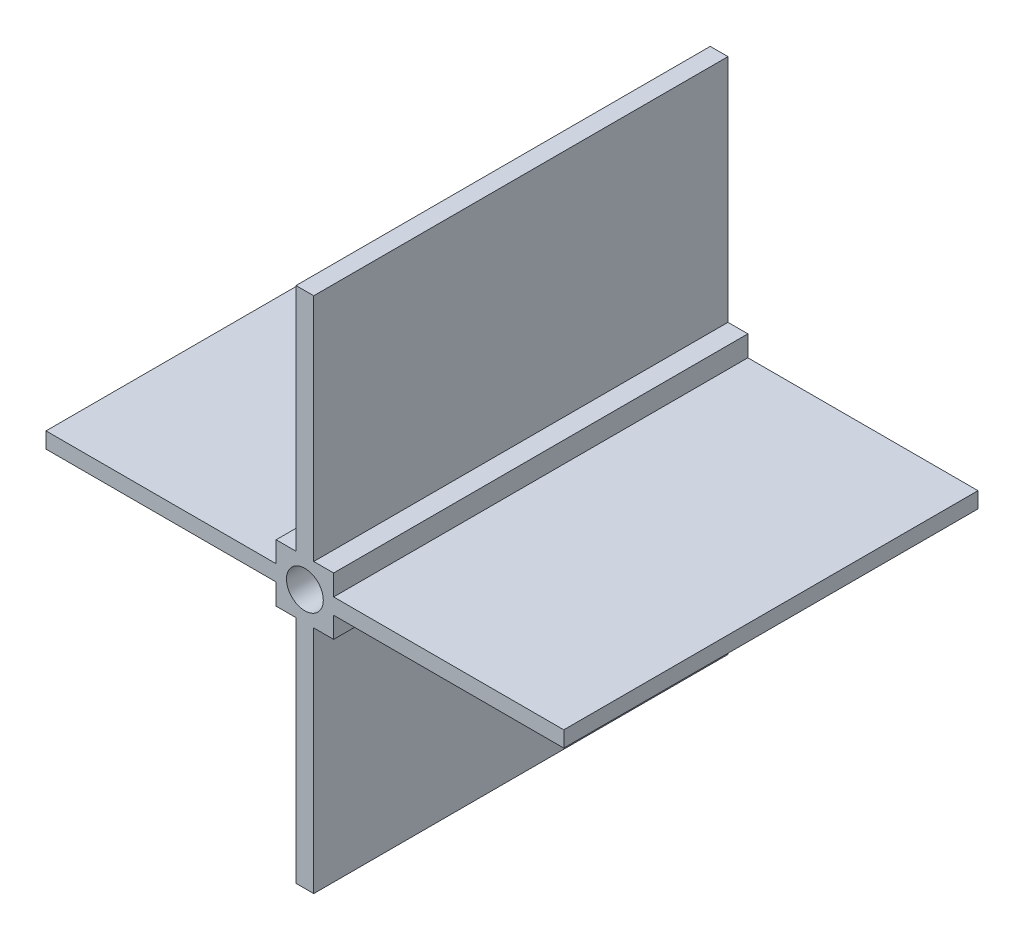
ISO-10303-21;
HEADER;
FILE_DESCRIPTION(('STEP AP214'),'2;1');
FILE_NAME('part.step','',(''),(''),'','','');
FILE_SCHEMA(('AUTOMOTIVE_DESIGN { 1 0 10303 214 1 1 1 1 }'));
ENDSEC;
DATA;
#1=APPLICATION_CONTEXT('core data for automotive mechanical design processes');
#2=APPLICATION_PROTOCOL_DEFINITION('international standard','automotive_design',2000,#1);
#3=PRODUCT_CONTEXT('',#1,'mechanical');
#4=PRODUCT('Part','Part','',(#3));
#5=PRODUCT_RELATED_PRODUCT_CATEGORY('part','',(#4));
#6=PRODUCT_DEFINITION_FORMATION('','',#4);
#7=PRODUCT_DEFINITION_CONTEXT('part definition',#1,'design');
#8=PRODUCT_DEFINITION('design','',#6,#7);
#9=PRODUCT_DEFINITION_SHAPE('','',#8);
#10=(LENGTH_UNIT() NAMED_UNIT(*) SI_UNIT(.MILLI.,.METRE.));
#11=(NAMED_UNIT(*) PLANE_ANGLE_UNIT() SI_UNIT($,.RADIAN.));
#12=(NAMED_UNIT(*) SI_UNIT($,.STERADIAN.) SOLID_ANGLE_UNIT());
#13=UNCERTAINTY_MEASURE_WITH_UNIT(LENGTH_MEASURE(1.E-05),#10,'distance_accuracy_value','');
#14=(GEOMETRIC_REPRESENTATION_CONTEXT(3) GLOBAL_UNCERTAINTY_ASSIGNED_CONTEXT((#13)) GLOBAL_UNIT_ASSIGNED_CONTEXT((#10,
#11,#12)) REPRESENTATION_CONTEXT('',''));
#15=CARTESIAN_POINT('',(0.,0.,0.));
#16=DIRECTION('',(0.,0.,1.));
#17=DIRECTION('',(1.,0.,0.));
#18=AXIS2_PLACEMENT_3D('',#15,#16,#17);
#19=CARTESIAN_POINT('',(0.978019252924109,3.175,45.72));
#20=DIRECTION('',(0.,-1.,0.));
#21=DIRECTION('',(0.,0.,-1.));
#22=AXIS2_PLACEMENT_3D('',#19,#20,#21);
#23=PLANE('',#22);
#24=DIRECTION('',(-1.,0.,0.));
#25=VECTOR('',#24,1.);
#26=CARTESIAN_POINT('',(0.978019252924109,3.175,0.));
#27=LINE('',#26,#25);
#28=CARTESIAN_POINT('',(3.17499999999999,3.175,0.));
#29=VERTEX_POINT('',#28);
#30=CARTESIAN_POINT('',(0.978019252924109,3.175,0.));
#31=VERTEX_POINT('',#30);
#32=EDGE_CURVE('E212',#29,#31,#27,.T.);
#33=ORIENTED_EDGE('',*,*,#32,.T.);
#34=DIRECTION('',(0.,0.,-1.));
#35=VECTOR('',#34,1.);
#36=CARTESIAN_POINT('',(0.978019252924109,3.175,45.72));
#37=LINE('',#36,#35);
#38=CARTESIAN_POINT('',(0.978019252924109,3.175,45.72));
#39=VERTEX_POINT('',#38);
#40=EDGE_CURVE('E11',#39,#31,#37,.T.);
#41=ORIENTED_EDGE('',*,*,#40,.F.);
#42=DIRECTION('',(-1.,0.,0.));
#43=VECTOR('',#42,1.);
#44=CARTESIAN_POINT('',(0.978019252924109,3.175,45.72));
#45=LINE('',#44,#43);
#46=CARTESIAN_POINT('',(3.17499999999999,3.175,45.72));
#47=VERTEX_POINT('',#46);
#48=EDGE_CURVE('E271',#47,#39,#45,.T.);
#49=ORIENTED_EDGE('',*,*,#48,.F.);
#50=DIRECTION('',(0.,0.,-1.));
#51=VECTOR('',#50,1.);
#52=CARTESIAN_POINT('',(3.17499999999999,3.175,45.72));
#53=LINE('',#52,#51);
#54=EDGE_CURVE('E208',#47,#29,#53,.T.);
#55=ORIENTED_EDGE('',*,*,#54,.T.);
#56=EDGE_LOOP('',(#33,#41,#49,#55));
#57=FACE_BOUND('',#56,.T.);
#58=ADVANCED_FACE('F39',(#57),#23,.F.);
#59=CARTESIAN_POINT('',(0.978019252924109,3.175,45.72));
#60=DIRECTION('',(-1.,0.,0.));
#61=DIRECTION('',(0.,0.,1.));
#62=AXIS2_PLACEMENT_3D('',#59,#60,#61);
#63=PLANE('',#62);
#64=DIRECTION('',(0.,1.,0.));
#65=VECTOR('',#64,1.);
#66=CARTESIAN_POINT('',(0.978019252924109,3.175,0.));
#67=LINE('',#66,#65);
#68=CARTESIAN_POINT('',(0.978019252924109,28.575,0.));
#69=VERTEX_POINT('',#68);
#70=EDGE_CURVE('E216',#31,#69,#67,.T.);
#71=ORIENTED_EDGE('',*,*,#70,.T.);
#72=DIRECTION('',(0.,0.,-1.));
#73=VECTOR('',#72,1.);
#74=CARTESIAN_POINT('',(0.978019252924109,28.575,45.72));
#75=LINE('',#74,#73);
#76=CARTESIAN_POINT('',(0.978019252924109,28.575,45.72));
#77=VERTEX_POINT('',#76);
#78=EDGE_CURVE('E48',#77,#69,#75,.T.);
#79=ORIENTED_EDGE('',*,*,#78,.F.);
#80=DIRECTION('',(0.,1.,0.));
#81=VECTOR('',#80,1.);
#82=CARTESIAN_POINT('',(0.978019252924109,3.175,45.72));
#83=LINE('',#82,#81);
#84=EDGE_CURVE('E135',#39,#77,#83,.T.);
#85=ORIENTED_EDGE('',*,*,#84,.F.);
#86=ORIENTED_EDGE('',*,*,#40,.T.);
#87=EDGE_LOOP('',(#71,#79,#85,#86));
#88=FACE_BOUND('',#87,.T.);
#89=ADVANCED_FACE('F422',(#88),#63,.F.);
#90=CARTESIAN_POINT('',(-0.979194969086342,28.575,45.72));
#91=DIRECTION('',(0.,-1.,0.));
#92=DIRECTION('',(0.,0.,-1.));
#93=AXIS2_PLACEMENT_3D('',#90,#91,#92);
#94=PLANE('',#93);
#95=DIRECTION('',(-1.,0.,0.));
#96=VECTOR('',#95,1.);
#97=CARTESIAN_POINT('',(-0.979194969086342,28.575,0.));
#98=LINE('',#97,#96);
#99=CARTESIAN_POINT('',(-0.979194969086342,28.575,0.));
#100=VERTEX_POINT('',#99);
#101=EDGE_CURVE('E220',#69,#100,#98,.T.);
#102=ORIENTED_EDGE('',*,*,#101,.T.);
#103=DIRECTION('',(0.,0.,-1.));
#104=VECTOR('',#103,1.);
#105=CARTESIAN_POINT('',(-0.979194969086342,28.575,45.72));
#106=LINE('',#105,#104);
#107=CARTESIAN_POINT('',(-0.979194969086342,28.575,45.72));
#108=VERTEX_POINT('',#107);
#109=EDGE_CURVE('E330',#108,#100,#106,.T.);
#110=ORIENTED_EDGE('',*,*,#109,.F.);
#111=DIRECTION('',(-1.,0.,0.));
#112=VECTOR('',#111,1.);
#113=CARTESIAN_POINT('',(-0.979194969086342,28.575,45.72));
#114=LINE('',#113,#112);
#115=EDGE_CURVE('E340',#77,#108,#114,.T.);
#116=ORIENTED_EDGE('',*,*,#115,.F.);
#117=ORIENTED_EDGE('',*,*,#78,.T.);
#118=EDGE_LOOP('',(#102,#110,#116,#117));
#119=FACE_BOUND('',#118,.T.);
#120=ADVANCED_FACE('F338',(#119),#94,.F.);
#121=CARTESIAN_POINT('',(-0.979194969086342,3.175,45.72));
#122=DIRECTION('',(1.,0.,0.));
#123=DIRECTION('',(0.,0.,-1.));
#124=AXIS2_PLACEMENT_3D('',#121,#122,#123);
#125=PLANE('',#124);
#126=DIRECTION('',(0.,-1.,0.));
#127=VECTOR('',#126,1.);
#128=CARTESIAN_POINT('',(-0.979194969086342,3.175,0.));
#129=LINE('',#128,#127);
#130=CARTESIAN_POINT('',(-0.979194969086342,3.175,0.));
#131=VERTEX_POINT('',#130);
#132=EDGE_CURVE('E223',#100,#131,#129,.T.);
#133=ORIENTED_EDGE('',*,*,#132,.T.);
#134=DIRECTION('',(0.,0.,-1.));
#135=VECTOR('',#134,1.);
#136=CARTESIAN_POINT('',(-0.979194969086342,3.175,45.72));
#137=LINE('',#136,#135);
#138=CARTESIAN_POINT('',(-0.979194969086342,3.175,45.72));
#139=VERTEX_POINT('',#138);
#140=EDGE_CURVE('E326',#139,#131,#137,.T.);
#141=ORIENTED_EDGE('',*,*,#140,.F.);
#142=DIRECTION('',(0.,-1.,0.));
#143=VECTOR('',#142,1.);
#144=CARTESIAN_POINT('',(-0.979194969086342,3.175,45.72));
#145=LINE('',#144,#143);
#146=EDGE_CURVE('E359',#108,#139,#145,.T.);
#147=ORIENTED_EDGE('',*,*,#146,.F.);
#148=ORIENTED_EDGE('',*,*,#109,.T.);
#149=EDGE_LOOP('',(#133,#141,#147,#148));
#150=FACE_BOUND('',#149,.T.);
#151=ADVANCED_FACE('F349',(#150),#125,.F.);
#152=CARTESIAN_POINT('',(-3.17500000000001,3.175,45.72));
#153=DIRECTION('',(0.,-1.,0.));
#154=DIRECTION('',(0.,0.,-1.));
#155=AXIS2_PLACEMENT_3D('',#152,#153,#154);
#156=PLANE('',#155);
#157=DIRECTION('',(-1.,0.,0.));
#158=VECTOR('',#157,1.);
#159=CARTESIAN_POINT('',(-3.17500000000001,3.175,0.));
#160=LINE('',#159,#158);
#161=CARTESIAN_POINT('',(-3.17500000000001,3.175,0.));
#162=VERTEX_POINT('',#161);
#163=EDGE_CURVE('E226',#131,#162,#160,.T.);
#164=ORIENTED_EDGE('',*,*,#163,.T.);
#165=DIRECTION('',(0.,0.,-1.));
#166=VECTOR('',#165,1.);
#167=CARTESIAN_POINT('',(-3.17500000000001,3.175,45.72));
#168=LINE('',#167,#166);
#169=CARTESIAN_POINT('',(-3.17500000000001,3.175,45.72));
#170=VERTEX_POINT('',#169);
#171=EDGE_CURVE('E322',#170,#162,#168,.T.);
#172=ORIENTED_EDGE('',*,*,#171,.F.);
#173=DIRECTION('',(-1.,0.,0.));
#174=VECTOR('',#173,1.);
#175=CARTESIAN_POINT('',(-3.17500000000001,3.175,45.72));
#176=LINE('',#175,#174);
#177=EDGE_CURVE('E355',#139,#170,#176,.T.);
#178=ORIENTED_EDGE('',*,*,#177,.F.);
#179=ORIENTED_EDGE('',*,*,#140,.T.);
#180=EDGE_LOOP('',(#164,#172,#178,#179));
#181=FACE_BOUND('',#180,.T.);
#182=ADVANCED_FACE('F353',(#181),#156,.F.);
#183=CARTESIAN_POINT('',(-3.17500000000001,0.884089911441718,45.72));
#184=DIRECTION('',(1.,0.,0.));
#185=DIRECTION('',(0.,0.,-1.));
#186=AXIS2_PLACEMENT_3D('',#183,#184,#185);
#187=PLANE('',#186);
#188=DIRECTION('',(0.,-1.,0.));
#189=VECTOR('',#188,1.);
#190=CARTESIAN_POINT('',(-3.17500000000001,0.884089911441718,0.));
#191=LINE('',#190,#189);
#192=CARTESIAN_POINT('',(-3.17500000000001,0.884089911441718,0.));
#193=VERTEX_POINT('',#192);
#194=EDGE_CURVE('E229',#162,#193,#191,.T.);
#195=ORIENTED_EDGE('',*,*,#194,.T.);
#196=DIRECTION('',(0.,0.,-1.));
#197=VECTOR('',#196,1.);
#198=CARTESIAN_POINT('',(-3.17500000000001,0.884089911441718,45.72));
#199=LINE('',#198,#197);
#200=CARTESIAN_POINT('',(-3.17500000000001,0.884089911441718,45.72));
#201=VERTEX_POINT('',#200);
#202=EDGE_CURVE('E318',#201,#193,#199,.T.);
#203=ORIENTED_EDGE('',*,*,#202,.F.);
#204=DIRECTION('',(0.,-1.,0.));
#205=VECTOR('',#204,1.);
#206=CARTESIAN_POINT('',(-3.17500000000001,0.884089911441718,45.72));
#207=LINE('',#206,#205);
#208=EDGE_CURVE('E358',#170,#201,#207,.T.);
#209=ORIENTED_EDGE('',*,*,#208,.F.);
#210=ORIENTED_EDGE('',*,*,#171,.T.);
#211=EDGE_LOOP('',(#195,#203,#209,#210));
#212=FACE_BOUND('',#211,.T.);
#213=ADVANCED_FACE('F435',(#212),#187,.F.);
#214=CARTESIAN_POINT('',(-3.17500000000001,0.884089911441718,45.72));
#215=DIRECTION('',(0.,-1.,0.));
#216=DIRECTION('',(1.,0.,0.));
#217=AXIS2_PLACEMENT_3D('',#214,#215,#216);
#218=PLANE('',#217);
#219=DIRECTION('',(-1.,0.,0.));
#220=VECTOR('',#219,1.);
#221=CARTESIAN_POINT('',(-3.17500000000001,0.884089911441718,0.));
#222=LINE('',#221,#220);
#223=CARTESIAN_POINT('',(-28.575,0.884089911441711,0.));
#224=VERTEX_POINT('',#223);
#225=EDGE_CURVE('E232',#193,#224,#222,.T.);
#226=ORIENTED_EDGE('',*,*,#225,.T.);
#227=DIRECTION('',(0.,0.,-1.));
#228=VECTOR('',#227,1.);
#229=CARTESIAN_POINT('',(-28.575,0.884089911441711,45.72));
#230=LINE('',#229,#228);
#231=CARTESIAN_POINT('',(-28.575,0.884089911441711,45.72));
#232=VERTEX_POINT('',#231);
#233=EDGE_CURVE('E314',#232,#224,#230,.T.);
#234=ORIENTED_EDGE('',*,*,#233,.F.);
#235=DIRECTION('',(-1.,0.,0.));
#236=VECTOR('',#235,1.);
#237=CARTESIAN_POINT('',(-3.17500000000001,0.884089911441718,45.72));
#238=LINE('',#237,#236);
#239=EDGE_CURVE('E363',#201,#232,#238,.T.);
#240=ORIENTED_EDGE('',*,*,#239,.F.);
#241=ORIENTED_EDGE('',*,*,#202,.T.);
#242=EDGE_LOOP('',(#226,#234,#240,#241));
#243=FACE_BOUND('',#242,.T.);
#244=ADVANCED_FACE('F438',(#243),#218,.F.);
#245=CARTESIAN_POINT('',(-28.575,0.884089911441711,45.72));
#246=DIRECTION('',(1.,0.,0.));
#247=DIRECTION('',(0.,0.,-1.));
#248=AXIS2_PLACEMENT_3D('',#245,#246,#247);
#249=PLANE('',#248);
#250=DIRECTION('',(0.,-1.,0.));
#251=VECTOR('',#250,1.);
#252=CARTESIAN_POINT('',(-28.575,0.884089911441711,0.));
#253=LINE('',#252,#251);
#254=CARTESIAN_POINT('',(-28.575,-0.862539989983386,0.));
#255=VERTEX_POINT('',#254);
#256=EDGE_CURVE('E235',#224,#255,#253,.T.);
#257=ORIENTED_EDGE('',*,*,#256,.T.);
#258=DIRECTION('',(0.,0.,-1.));
#259=VECTOR('',#258,1.);
#260=CARTESIAN_POINT('',(-28.575,-0.862539989983386,45.72));
#261=LINE('',#260,#259);
#262=CARTESIAN_POINT('',(-28.575,-0.862539989983386,45.72));
#263=VERTEX_POINT('',#262);
#264=EDGE_CURVE('E310',#263,#255,#261,.T.);
#265=ORIENTED_EDGE('',*,*,#264,.F.);
#266=DIRECTION('',(0.,-1.,0.));
#267=VECTOR('',#266,1.);
#268=CARTESIAN_POINT('',(-28.575,0.884089911441711,45.72));
#269=LINE('',#268,#267);
#270=EDGE_CURVE('E370',#232,#263,#269,.T.);
#271=ORIENTED_EDGE('',*,*,#270,.F.);
#272=ORIENTED_EDGE('',*,*,#233,.T.);
#273=EDGE_LOOP('',(#257,#265,#271,#272));
#274=FACE_BOUND('',#273,.T.);
#275=ADVANCED_FACE('F442',(#274),#249,.F.);
#276=CARTESIAN_POINT('',(-3.17500000000001,-0.862539989983382,45.72));
#277=DIRECTION('',(0.,1.,0.));
#278=DIRECTION('',(-1.,0.,0.));
#279=AXIS2_PLACEMENT_3D('',#276,#277,#278);
#280=PLANE('',#279);
#281=DIRECTION('',(1.,0.,0.));
#282=VECTOR('',#281,1.);
#283=CARTESIAN_POINT('',(-3.17500000000001,-0.862539989983382,0.));
#284=LINE('',#283,#282);
#285=CARTESIAN_POINT('',(-3.17500000000001,-0.862539989983382,0.));
#286=VERTEX_POINT('',#285);
#287=EDGE_CURVE('E238',#255,#286,#284,.T.);
#288=ORIENTED_EDGE('',*,*,#287,.T.);
#289=DIRECTION('',(0.,0.,-1.));
#290=VECTOR('',#289,1.);
#291=CARTESIAN_POINT('',(-3.17500000000001,-0.862539989983382,45.72));
#292=LINE('',#291,#290);
#293=CARTESIAN_POINT('',(-3.17500000000001,-0.862539989983382,45.72));
#294=VERTEX_POINT('',#293);
#295=EDGE_CURVE('E306',#294,#286,#292,.T.);
#296=ORIENTED_EDGE('',*,*,#295,.F.);
#297=DIRECTION('',(1.,0.,0.));
#298=VECTOR('',#297,1.);
#299=CARTESIAN_POINT('',(-3.17500000000001,-0.862539989983382,45.72));
#300=LINE('',#299,#298);
#301=EDGE_CURVE('E373',#263,#294,#300,.T.);
#302=ORIENTED_EDGE('',*,*,#301,.F.);
#303=ORIENTED_EDGE('',*,*,#264,.T.);
#304=EDGE_LOOP('',(#288,#296,#302,#303));
#305=FACE_BOUND('',#304,.T.);
#306=ADVANCED_FACE('F446',(#305),#280,.F.);
#307=CARTESIAN_POINT('',(-3.17500000000001,-3.175,45.72));
#308=DIRECTION('',(1.,0.,0.));
#309=DIRECTION('',(0.,0.,-1.));
#310=AXIS2_PLACEMENT_3D('',#307,#308,#309);
#311=PLANE('',#310);
#312=DIRECTION('',(0.,-1.,0.));
#313=VECTOR('',#312,1.);
#314=CARTESIAN_POINT('',(-3.17500000000001,-3.175,0.));
#315=LINE('',#314,#313);
#316=CARTESIAN_POINT('',(-3.17500000000001,-3.175,0.));
#317=VERTEX_POINT('',#316);
#318=EDGE_CURVE('E241',#286,#317,#315,.T.);
#319=ORIENTED_EDGE('',*,*,#318,.T.);
#320=DIRECTION('',(0.,0.,-1.));
#321=VECTOR('',#320,1.);
#322=CARTESIAN_POINT('',(-3.17500000000001,-3.175,45.72));
#323=LINE('',#322,#321);
#324=CARTESIAN_POINT('',(-3.17500000000001,-3.175,45.72));
#325=VERTEX_POINT('',#324);
#326=EDGE_CURVE('E302',#325,#317,#323,.T.);
#327=ORIENTED_EDGE('',*,*,#326,.F.);
#328=DIRECTION('',(0.,-1.,0.));
#329=VECTOR('',#328,1.);
#330=CARTESIAN_POINT('',(-3.17500000000001,-3.175,45.72));
#331=LINE('',#330,#329);
#332=EDGE_CURVE('E376',#294,#325,#331,.T.);
#333=ORIENTED_EDGE('',*,*,#332,.F.);
#334=ORIENTED_EDGE('',*,*,#295,.T.);
#335=EDGE_LOOP('',(#319,#327,#333,#334));
#336=FACE_BOUND('',#335,.T.);
#337=ADVANCED_FACE('F450',(#336),#311,.F.);
#338=CARTESIAN_POINT('',(-3.17500000000001,-3.175,45.72));
#339=DIRECTION('',(0.,1.,0.));
#340=DIRECTION('',(0.,0.,1.));
#341=AXIS2_PLACEMENT_3D('',#338,#339,#340);
#342=PLANE('',#341);
#343=DIRECTION('',(1.,0.,0.));
#344=VECTOR('',#343,1.);
#345=CARTESIAN_POINT('',(-3.17500000000001,-3.175,0.));
#346=LINE('',#345,#344);
#347=CARTESIAN_POINT('',(-0.979194969086342,-3.175,0.));
#348=VERTEX_POINT('',#347);
#349=EDGE_CURVE('E244',#317,#348,#346,.T.);
#350=ORIENTED_EDGE('',*,*,#349,.T.);
#351=DIRECTION('',(0.,0.,-1.));
#352=VECTOR('',#351,1.);
#353=CARTESIAN_POINT('',(-0.979194969086342,-3.175,45.72));
#354=LINE('',#353,#352);
#355=CARTESIAN_POINT('',(-0.979194969086342,-3.175,45.72));
#356=VERTEX_POINT('',#355);
#357=EDGE_CURVE('E298',#356,#348,#354,.T.);
#358=ORIENTED_EDGE('',*,*,#357,.F.);
#359=DIRECTION('',(1.,0.,0.));
#360=VECTOR('',#359,1.);
#361=CARTESIAN_POINT('',(-3.17500000000001,-3.175,45.72));
#362=LINE('',#361,#360);
#363=EDGE_CURVE('E379',#325,#356,#362,.T.);
#364=ORIENTED_EDGE('',*,*,#363,.F.);
#365=ORIENTED_EDGE('',*,*,#326,.T.);
#366=EDGE_LOOP('',(#350,#358,#364,#365));
#367=FACE_BOUND('',#366,.T.);
#368=ADVANCED_FACE('F454',(#367),#342,.F.);
#369=CARTESIAN_POINT('',(-0.979194969086342,-3.175,45.72));
#370=DIRECTION('',(1.,0.,0.));
#371=DIRECTION('',(0.,1.,0.));
#372=AXIS2_PLACEMENT_3D('',#369,#370,#371);
#373=PLANE('',#372);
#374=DIRECTION('',(0.,-1.,0.));
#375=VECTOR('',#374,1.);
#376=CARTESIAN_POINT('',(-0.979194969086342,-3.175,0.));
#377=LINE('',#376,#375);
#378=CARTESIAN_POINT('',(-0.979194969086337,-28.575,0.));
#379=VERTEX_POINT('',#378);
#380=EDGE_CURVE('E247',#348,#379,#377,.T.);
#381=ORIENTED_EDGE('',*,*,#380,.T.);
#382=DIRECTION('',(0.,0.,-1.));
#383=VECTOR('',#382,1.);
#384=CARTESIAN_POINT('',(-0.979194969086337,-28.575,45.72));
#385=LINE('',#384,#383);
#386=CARTESIAN_POINT('',(-0.979194969086337,-28.575,45.72));
#387=VERTEX_POINT('',#386);
#388=EDGE_CURVE('E294',#387,#379,#385,.T.);
#389=ORIENTED_EDGE('',*,*,#388,.F.);
#390=DIRECTION('',(0.,-1.,0.));
#391=VECTOR('',#390,1.);
#392=CARTESIAN_POINT('',(-0.979194969086342,-3.175,45.72));
#393=LINE('',#392,#391);
#394=EDGE_CURVE('E382',#356,#387,#393,.T.);
#395=ORIENTED_EDGE('',*,*,#394,.F.);
#396=ORIENTED_EDGE('',*,*,#357,.T.);
#397=EDGE_LOOP('',(#381,#389,#395,#396));
#398=FACE_BOUND('',#397,.T.);
#399=ADVANCED_FACE('F458',(#398),#373,.F.);
#400=CARTESIAN_POINT('',(-0.979194969086337,-28.575,45.72));
#401=DIRECTION('',(0.,1.,0.));
#402=DIRECTION('',(0.,0.,1.));
#403=AXIS2_PLACEMENT_3D('',#400,#401,#402);
#404=PLANE('',#403);
#405=DIRECTION('',(1.,0.,0.));
#406=VECTOR('',#405,1.);
#407=CARTESIAN_POINT('',(-0.979194969086337,-28.575,0.));
#408=LINE('',#407,#406);
#409=CARTESIAN_POINT('',(0.978019252924112,-28.575,0.));
#410=VERTEX_POINT('',#409);
#411=EDGE_CURVE('E250',#379,#410,#408,.T.);
#412=ORIENTED_EDGE('',*,*,#411,.T.);
#413=DIRECTION('',(0.,0.,-1.));
#414=VECTOR('',#413,1.);
#415=CARTESIAN_POINT('',(0.978019252924112,-28.575,45.72));
#416=LINE('',#415,#414);
#417=CARTESIAN_POINT('',(0.978019252924112,-28.575,45.72));
#418=VERTEX_POINT('',#417);
#419=EDGE_CURVE('E290',#418,#410,#416,.T.);
#420=ORIENTED_EDGE('',*,*,#419,.F.);
#421=DIRECTION('',(1.,0.,0.));
#422=VECTOR('',#421,1.);
#423=CARTESIAN_POINT('',(-0.979194969086337,-28.575,45.72));
#424=LINE('',#423,#422);
#425=EDGE_CURVE('E385',#387,#418,#424,.T.);
#426=ORIENTED_EDGE('',*,*,#425,.F.);
#427=ORIENTED_EDGE('',*,*,#388,.T.);
#428=EDGE_LOOP('',(#412,#420,#426,#427));
#429=FACE_BOUND('',#428,.T.);
#430=ADVANCED_FACE('F462',(#429),#404,.F.);
#431=CARTESIAN_POINT('',(0.978019252924109,-3.175,45.72));
#432=DIRECTION('',(-1.,0.,0.));
#433=DIRECTION('',(0.,-1.,0.));
#434=AXIS2_PLACEMENT_3D('',#431,#432,#433);
#435=PLANE('',#434);
#436=DIRECTION('',(0.,1.,0.));
#437=VECTOR('',#436,1.);
#438=CARTESIAN_POINT('',(0.978019252924109,-3.175,0.));
#439=LINE('',#438,#437);
#440=CARTESIAN_POINT('',(0.978019252924109,-3.175,0.));
#441=VERTEX_POINT('',#440);
#442=EDGE_CURVE('E253',#410,#441,#439,.T.);
#443=ORIENTED_EDGE('',*,*,#442,.T.);
#444=DIRECTION('',(0.,0.,-1.));
#445=VECTOR('',#444,1.);
#446=CARTESIAN_POINT('',(0.978019252924109,-3.175,45.72));
#447=LINE('',#446,#445);
#448=CARTESIAN_POINT('',(0.978019252924109,-3.175,45.72));
#449=VERTEX_POINT('',#448);
#450=EDGE_CURVE('E286',#449,#441,#447,.T.);
#451=ORIENTED_EDGE('',*,*,#450,.F.);
#452=DIRECTION('',(0.,1.,0.));
#453=VECTOR('',#452,1.);
#454=CARTESIAN_POINT('',(0.978019252924109,-3.175,45.72));
#455=LINE('',#454,#453);
#456=EDGE_CURVE('E388',#418,#449,#455,.T.);
#457=ORIENTED_EDGE('',*,*,#456,.F.);
#458=ORIENTED_EDGE('',*,*,#419,.T.);
#459=EDGE_LOOP('',(#443,#451,#457,#458));
#460=FACE_BOUND('',#459,.T.);
#461=ADVANCED_FACE('F466',(#460),#435,.F.);
#462=CARTESIAN_POINT('',(0.978019252924109,-3.175,45.72));
#463=DIRECTION('',(0.,1.,0.));
#464=DIRECTION('',(0.,0.,1.));
#465=AXIS2_PLACEMENT_3D('',#462,#463,#464);
#466=PLANE('',#465);
#467=DIRECTION('',(1.,0.,0.));
#468=VECTOR('',#467,1.);
#469=CARTESIAN_POINT('',(0.978019252924109,-3.175,0.));
#470=LINE('',#469,#468);
#471=CARTESIAN_POINT('',(3.17499999999999,-3.175,0.));
#472=VERTEX_POINT('',#471);
#473=EDGE_CURVE('E256',#441,#472,#470,.T.);
#474=ORIENTED_EDGE('',*,*,#473,.T.);
#475=DIRECTION('',(0.,0.,-1.));
#476=VECTOR('',#475,1.);
#477=CARTESIAN_POINT('',(3.17499999999999,-3.175,45.72));
#478=LINE('',#477,#476);
#479=CARTESIAN_POINT('',(3.17499999999999,-3.175,45.72));
#480=VERTEX_POINT('',#479);
#481=EDGE_CURVE('E282',#480,#472,#478,.T.);
#482=ORIENTED_EDGE('',*,*,#481,.F.);
#483=DIRECTION('',(1.,0.,0.));
#484=VECTOR('',#483,1.);
#485=CARTESIAN_POINT('',(0.978019252924109,-3.175,45.72));
#486=LINE('',#485,#484);
#487=EDGE_CURVE('E391',#449,#480,#486,.T.);
#488=ORIENTED_EDGE('',*,*,#487,.F.);
#489=ORIENTED_EDGE('',*,*,#450,.T.);
#490=EDGE_LOOP('',(#474,#482,#488,#489));
#491=FACE_BOUND('',#490,.T.);
#492=ADVANCED_FACE('F470',(#491),#466,.F.);
#493=CARTESIAN_POINT('',(3.17499999999999,-3.175,45.72));
#494=DIRECTION('',(-1.,0.,0.));
#495=DIRECTION('',(0.,0.,1.));
#496=AXIS2_PLACEMENT_3D('',#493,#494,#495);
#497=PLANE('',#496);
#498=DIRECTION('',(0.,1.,0.));
#499=VECTOR('',#498,1.);
#500=CARTESIAN_POINT('',(3.17499999999999,-3.175,0.));
#501=LINE('',#500,#499);
#502=CARTESIAN_POINT('',(3.17499999999999,-0.862539989983382,0.));
#503=VERTEX_POINT('',#502);
#504=EDGE_CURVE('E259',#472,#503,#501,.T.);
#505=ORIENTED_EDGE('',*,*,#504,.T.);
#506=DIRECTION('',(0.,0.,-1.));
#507=VECTOR('',#506,1.);
#508=CARTESIAN_POINT('',(3.17499999999999,-0.862539989983382,45.72));
#509=LINE('',#508,#507);
#510=CARTESIAN_POINT('',(3.17499999999999,-0.862539989983382,45.72));
#511=VERTEX_POINT('',#510);
#512=EDGE_CURVE('E278',#511,#503,#509,.T.);
#513=ORIENTED_EDGE('',*,*,#512,.F.);
#514=DIRECTION('',(0.,1.,0.));
#515=VECTOR('',#514,1.);
#516=CARTESIAN_POINT('',(3.17499999999999,-3.175,45.72));
#517=LINE('',#516,#515);
#518=EDGE_CURVE('E394',#480,#511,#517,.T.);
#519=ORIENTED_EDGE('',*,*,#518,.F.);
#520=ORIENTED_EDGE('',*,*,#481,.T.);
#521=EDGE_LOOP('',(#505,#513,#519,#520));
#522=FACE_BOUND('',#521,.T.);
#523=ADVANCED_FACE('F402',(#522),#497,.F.);
#524=CARTESIAN_POINT('',(3.17499999999999,-0.862539989983382,45.72));
#525=DIRECTION('',(0.,1.,0.));
#526=DIRECTION('',(0.,0.,1.));
#527=AXIS2_PLACEMENT_3D('',#524,#525,#526);
#528=PLANE('',#527);
#529=DIRECTION('',(1.,0.,0.));
#530=VECTOR('',#529,1.);
#531=CARTESIAN_POINT('',(3.17499999999999,-0.862539989983382,0.));
#532=LINE('',#531,#530);
#533=CARTESIAN_POINT('',(28.575,-0.862539989983382,0.));
#534=VERTEX_POINT('',#533);
#535=EDGE_CURVE('E262',#503,#534,#532,.T.);
#536=ORIENTED_EDGE('',*,*,#535,.T.);
#537=DIRECTION('',(0.,0.,-1.));
#538=VECTOR('',#537,1.);
#539=CARTESIAN_POINT('',(28.575,-0.862539989983382,45.72));
#540=LINE('',#539,#538);
#541=CARTESIAN_POINT('',(28.575,-0.862539989983382,45.72));
#542=VERTEX_POINT('',#541);
#543=EDGE_CURVE('E201',#542,#534,#540,.T.);
#544=ORIENTED_EDGE('',*,*,#543,.F.);
#545=DIRECTION('',(1.,0.,0.));
#546=VECTOR('',#545,1.);
#547=CARTESIAN_POINT('',(3.17499999999999,-0.862539989983382,45.72));
#548=LINE('',#547,#546);
#549=EDGE_CURVE('E190',#511,#542,#548,.T.);
#550=ORIENTED_EDGE('',*,*,#549,.F.);
#551=ORIENTED_EDGE('',*,*,#512,.T.);
#552=EDGE_LOOP('',(#536,#544,#550,#551));
#553=FACE_BOUND('',#552,.T.);
#554=ADVANCED_FACE('F406',(#553),#528,.F.);
#555=CARTESIAN_POINT('',(28.575,0.884089911441718,45.72));
#556=DIRECTION('',(-1.,0.,0.));
#557=DIRECTION('',(0.,0.,1.));
#558=AXIS2_PLACEMENT_3D('',#555,#556,#557);
#559=PLANE('',#558);
#560=DIRECTION('',(0.,1.,0.));
#561=VECTOR('',#560,1.);
#562=CARTESIAN_POINT('',(28.575,0.884089911441718,0.));
#563=LINE('',#562,#561);
#564=CARTESIAN_POINT('',(28.575,0.884089911441718,0.));
#565=VERTEX_POINT('',#564);
#566=EDGE_CURVE('E199',#534,#565,#563,.T.);
#567=ORIENTED_EDGE('',*,*,#566,.T.);
#568=DIRECTION('',(0.,0.,-1.));
#569=VECTOR('',#568,1.);
#570=CARTESIAN_POINT('',(28.575,0.884089911441718,45.72));
#571=LINE('',#570,#569);
#572=CARTESIAN_POINT('',(28.575,0.884089911441718,45.72));
#573=VERTEX_POINT('',#572);
#574=EDGE_CURVE('E196',#573,#565,#571,.T.);
#575=ORIENTED_EDGE('',*,*,#574,.F.);
#576=DIRECTION('',(0.,1.,0.));
#577=VECTOR('',#576,1.);
#578=CARTESIAN_POINT('',(28.575,0.884089911441718,45.72));
#579=LINE('',#578,#577);
#580=EDGE_CURVE('E184',#542,#573,#579,.T.);
#581=ORIENTED_EDGE('',*,*,#580,.F.);
#582=ORIENTED_EDGE('',*,*,#543,.T.);
#583=EDGE_LOOP('',(#567,#575,#581,#582));
#584=FACE_BOUND('',#583,.T.);
#585=ADVANCED_FACE('F197',(#584),#559,.F.);
#586=CARTESIAN_POINT('',(3.17499999999999,0.884089911441718,45.72));
#587=DIRECTION('',(0.,-1.,0.));
#588=DIRECTION('',(0.,0.,-1.));
#589=AXIS2_PLACEMENT_3D('',#586,#587,#588);
#590=PLANE('',#589);
#591=DIRECTION('',(-1.,0.,0.));
#592=VECTOR('',#591,1.);
#593=CARTESIAN_POINT('',(3.17499999999999,0.884089911441718,0.));
#594=LINE('',#593,#592);
#595=CARTESIAN_POINT('',(3.17499999999999,0.884089911441718,0.));
#596=VERTEX_POINT('',#595);
#597=EDGE_CURVE('E121',#565,#596,#594,.T.);
#598=ORIENTED_EDGE('',*,*,#597,.T.);
#599=DIRECTION('',(0.,0.,-1.));
#600=VECTOR('',#599,1.);
#601=CARTESIAN_POINT('',(3.17499999999999,0.884089911441718,45.72));
#602=LINE('',#601,#600);
#603=CARTESIAN_POINT('',(3.17499999999999,0.884089911441718,45.72));
#604=VERTEX_POINT('',#603);
#605=EDGE_CURVE('E202',#604,#596,#602,.T.);
#606=ORIENTED_EDGE('',*,*,#605,.F.);
#607=DIRECTION('',(-1.,0.,0.));
#608=VECTOR('',#607,1.);
#609=CARTESIAN_POINT('',(3.17499999999999,0.884089911441718,45.72));
#610=LINE('',#609,#608);
#611=EDGE_CURVE('E188',#573,#604,#610,.T.);
#612=ORIENTED_EDGE('',*,*,#611,.F.);
#613=ORIENTED_EDGE('',*,*,#574,.T.);
#614=EDGE_LOOP('',(#598,#606,#612,#613));
#615=FACE_BOUND('',#614,.T.);
#616=ADVANCED_FACE('F204',(#615),#590,.F.);
#617=CARTESIAN_POINT('',(3.17499999999999,0.884089911441718,45.72));
#618=DIRECTION('',(-1.,0.,0.));
#619=DIRECTION('',(0.,0.,1.));
#620=AXIS2_PLACEMENT_3D('',#617,#618,#619);
#621=PLANE('',#620);
#622=DIRECTION('',(0.,1.,0.));
#623=VECTOR('',#622,1.);
#624=CARTESIAN_POINT('',(3.17499999999999,0.884089911441718,0.));
#625=LINE('',#624,#623);
#626=EDGE_CURVE('E127',#596,#29,#625,.T.);
#627=ORIENTED_EDGE('',*,*,#626,.T.);
#628=ORIENTED_EDGE('',*,*,#54,.F.);
#629=DIRECTION('',(0.,1.,0.));
#630=VECTOR('',#629,1.);
#631=CARTESIAN_POINT('',(3.17499999999999,0.884089911441718,45.72));
#632=LINE('',#631,#630);
#633=EDGE_CURVE('E56',#604,#47,#632,.T.);
#634=ORIENTED_EDGE('',*,*,#633,.F.);
#635=ORIENTED_EDGE('',*,*,#605,.T.);
#636=EDGE_LOOP('',(#627,#628,#634,#635));
#637=FACE_BOUND('',#636,.T.);
#638=ADVANCED_FACE('F410',(#637),#621,.F.);
#639=CARTESIAN_POINT('',(0.,0.,45.72));
#640=DIRECTION('',(0.,0.,1.));
#641=DIRECTION('',(1.,0.,0.));
#642=AXIS2_PLACEMENT_3D('',#639,#640,#641);
#643=PLANE('',#642);
#644=CARTESIAN_POINT('',(0.,0.,45.72));
#645=DIRECTION('',(0.,0.,1.));
#646=DIRECTION('',(1.,0.,0.));
#647=AXIS2_PLACEMENT_3D('',#644,#645,#646);
#648=CIRCLE('',#647,2.032);
#649=CARTESIAN_POINT('',(2.032,0.,45.72));
#650=VERTEX_POINT('',#649);
#651=EDGE_CURVE('E525',#650,#650,#648,.T.);
#652=ORIENTED_EDGE('',*,*,#651,.F.);
#653=EDGE_LOOP('',(#652));
#654=FACE_BOUND('',#653,.T.);
#655=ORIENTED_EDGE('',*,*,#48,.T.);
#656=ORIENTED_EDGE('',*,*,#84,.T.);
#657=ORIENTED_EDGE('',*,*,#115,.T.);
#658=ORIENTED_EDGE('',*,*,#146,.T.);
#659=ORIENTED_EDGE('',*,*,#177,.T.);
#660=ORIENTED_EDGE('',*,*,#208,.T.);
#661=ORIENTED_EDGE('',*,*,#239,.T.);
#662=ORIENTED_EDGE('',*,*,#270,.T.);
#663=ORIENTED_EDGE('',*,*,#301,.T.);
#664=ORIENTED_EDGE('',*,*,#332,.T.);
#665=ORIENTED_EDGE('',*,*,#363,.T.);
#666=ORIENTED_EDGE('',*,*,#394,.T.);
#667=ORIENTED_EDGE('',*,*,#425,.T.);
#668=ORIENTED_EDGE('',*,*,#456,.T.);
#669=ORIENTED_EDGE('',*,*,#487,.T.);
#670=ORIENTED_EDGE('',*,*,#518,.T.);
#671=ORIENTED_EDGE('',*,*,#549,.T.);
#672=ORIENTED_EDGE('',*,*,#580,.T.);
#673=ORIENTED_EDGE('',*,*,#611,.T.);
#674=ORIENTED_EDGE('',*,*,#633,.T.);
#675=EDGE_LOOP('',(#655,#656,#657,#658,#659,#660,#661,#662,#663,#664,#665,#666,#667,#668,#669,
#670,#671,#672,#673,#674));
#676=FACE_BOUND('',#675,.T.);
#677=ADVANCED_FACE('F186',(#654,#676),#643,.T.);
#678=CARTESIAN_POINT('',(0.,0.,0.));
#679=DIRECTION('',(0.,0.,1.));
#680=DIRECTION('',(1.,0.,0.));
#681=AXIS2_PLACEMENT_3D('',#678,#679,#680);
#682=PLANE('',#681);
#683=CARTESIAN_POINT('',(0.,0.,0.));
#684=DIRECTION('',(0.,0.,1.));
#685=DIRECTION('',(1.,0.,0.));
#686=AXIS2_PLACEMENT_3D('',#683,#684,#685);
#687=CIRCLE('',#686,2.032);
#688=CARTESIAN_POINT('',(2.032,0.,0.));
#689=VERTEX_POINT('',#688);
#690=EDGE_CURVE('E217',#689,#689,#687,.T.);
#691=ORIENTED_EDGE('',*,*,#690,.T.);
#692=EDGE_LOOP('',(#691));
#693=FACE_BOUND('',#692,.T.);
#694=ORIENTED_EDGE('',*,*,#32,.F.);
#695=ORIENTED_EDGE('',*,*,#626,.F.);
#696=ORIENTED_EDGE('',*,*,#597,.F.);
#697=ORIENTED_EDGE('',*,*,#566,.F.);
#698=ORIENTED_EDGE('',*,*,#535,.F.);
#699=ORIENTED_EDGE('',*,*,#504,.F.);
#700=ORIENTED_EDGE('',*,*,#473,.F.);
#701=ORIENTED_EDGE('',*,*,#442,.F.);
#702=ORIENTED_EDGE('',*,*,#411,.F.);
#703=ORIENTED_EDGE('',*,*,#380,.F.);
#704=ORIENTED_EDGE('',*,*,#349,.F.);
#705=ORIENTED_EDGE('',*,*,#318,.F.);
#706=ORIENTED_EDGE('',*,*,#287,.F.);
#707=ORIENTED_EDGE('',*,*,#256,.F.);
#708=ORIENTED_EDGE('',*,*,#225,.F.);
#709=ORIENTED_EDGE('',*,*,#194,.F.);
#710=ORIENTED_EDGE('',*,*,#163,.F.);
#711=ORIENTED_EDGE('',*,*,#132,.F.);
#712=ORIENTED_EDGE('',*,*,#101,.F.);
#713=ORIENTED_EDGE('',*,*,#70,.F.);
#714=EDGE_LOOP('',(#694,#695,#696,#697,#698,#699,#700,#701,#702,#703,#704,#705,#706,#707,#708,
#709,#710,#711,#712,#713));
#715=FACE_BOUND('',#714,.T.);
#716=ADVANCED_FACE('F344',(#693,#715),#682,.F.);
#717=CARTESIAN_POINT('',(0.,0.,0.));
#718=DIRECTION('',(0.,0.,1.));
#719=DIRECTION('',(1.,0.,0.));
#720=AXIS2_PLACEMENT_3D('',#717,#718,#719);
#721=CYLINDRICAL_SURFACE('',#720,2.032);
#722=ORIENTED_EDGE('',*,*,#690,.F.);
#723=EDGE_LOOP('',(#722));
#724=FACE_BOUND('',#723,.T.);
#725=ORIENTED_EDGE('',*,*,#651,.T.);
#726=EDGE_LOOP('',(#725));
#727=FACE_BOUND('',#726,.T.);
#728=ADVANCED_FACE('F507',(#724,#727),#721,.F.);
#729=CLOSED_SHELL('',(#58,#89,#120,#151,#182,#213,#244,#275,#306,#337,#368,#399,#430,#461,#492,
#523,#554,#585,#616,#638,#677,#716,#728));
#730=MANIFOLD_SOLID_BREP('B2',#729);
#731=ADVANCED_BREP_SHAPE_REPRESENTATION('',(#18,#730),#14);
#732=SHAPE_DEFINITION_REPRESENTATION(#9,#731);
ENDSEC;
END-ISO-10303-21;
